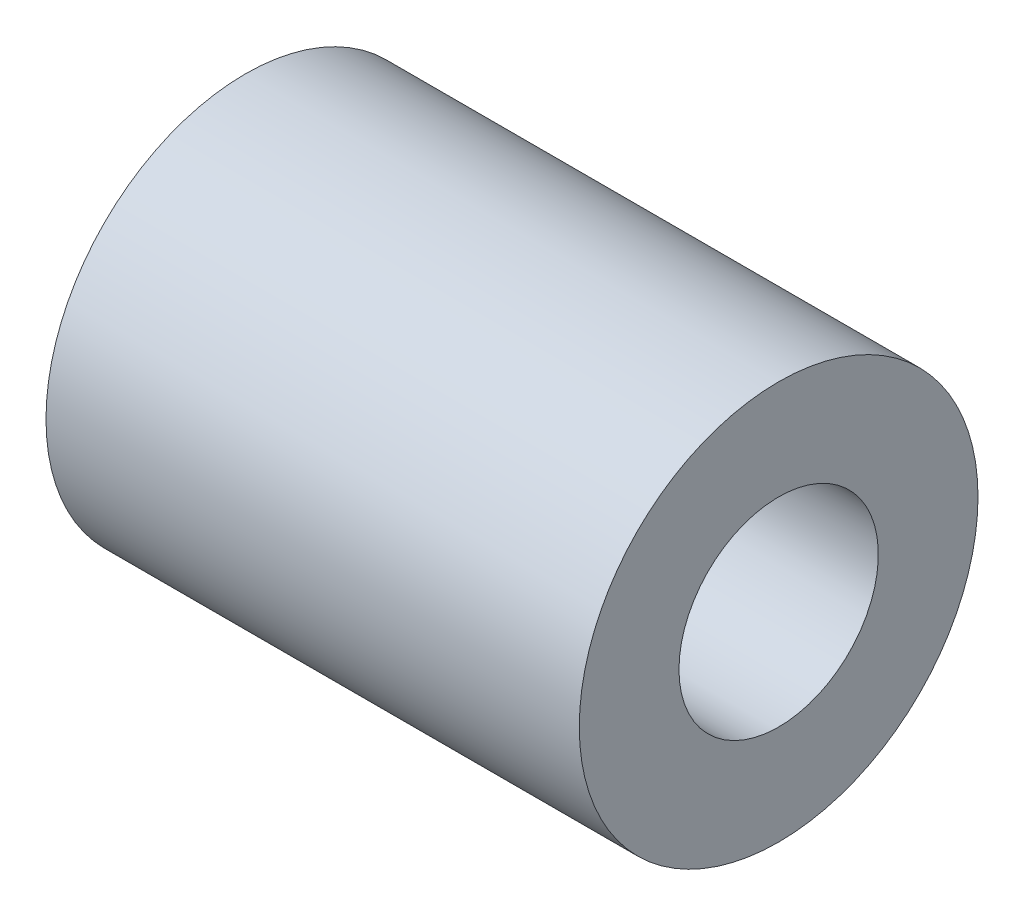
ISO-10303-21;
HEADER;
FILE_DESCRIPTION(('STEP AP214'),'2;1');
FILE_NAME('part.step','',(''),(''),'','','');
FILE_SCHEMA(('AUTOMOTIVE_DESIGN { 1 0 10303 214 1 1 1 1 }'));
ENDSEC;
DATA;
#1=APPLICATION_CONTEXT('core data for automotive mechanical design processes');
#2=APPLICATION_PROTOCOL_DEFINITION('international standard','automotive_design',2000,#1);
#3=PRODUCT_CONTEXT('',#1,'mechanical');
#4=PRODUCT('Part','Part','',(#3));
#5=PRODUCT_RELATED_PRODUCT_CATEGORY('part','',(#4));
#6=PRODUCT_DEFINITION_FORMATION('','',#4);
#7=PRODUCT_DEFINITION_CONTEXT('part definition',#1,'design');
#8=PRODUCT_DEFINITION('design','',#6,#7);
#9=PRODUCT_DEFINITION_SHAPE('','',#8);
#10=(LENGTH_UNIT() NAMED_UNIT(*) SI_UNIT(.MILLI.,.METRE.));
#11=(NAMED_UNIT(*) PLANE_ANGLE_UNIT() SI_UNIT($,.RADIAN.));
#12=(NAMED_UNIT(*) SI_UNIT($,.STERADIAN.) SOLID_ANGLE_UNIT());
#13=UNCERTAINTY_MEASURE_WITH_UNIT(LENGTH_MEASURE(1.E-05),#10,'distance_accuracy_value','');
#14=(GEOMETRIC_REPRESENTATION_CONTEXT(3) GLOBAL_UNCERTAINTY_ASSIGNED_CONTEXT((#13)) GLOBAL_UNIT_ASSIGNED_CONTEXT((#10,
#11,#12)) REPRESENTATION_CONTEXT('',''));
#15=CARTESIAN_POINT('',(0.,0.,0.));
#16=DIRECTION('',(0.,0.,1.));
#17=DIRECTION('',(1.,0.,0.));
#18=AXIS2_PLACEMENT_3D('',#15,#16,#17);
#19=CARTESIAN_POINT('',(34.25,-55.,7.));
#20=DIRECTION('',(-1.,0.,0.));
#21=DIRECTION('',(0.,0.,1.));
#22=AXIS2_PLACEMENT_3D('',#19,#20,#21);
#23=CYLINDRICAL_SURFACE('',#22,2.);
#24=CARTESIAN_POINT('',(44.95,-55.,7.));
#25=DIRECTION('',(-1.,0.,0.));
#26=DIRECTION('',(0.,0.,1.));
#27=AXIS2_PLACEMENT_3D('',#24,#25,#26);
#28=CIRCLE('',#27,2.);
#29=CARTESIAN_POINT('',(44.95,-55.,9.));
#30=VERTEX_POINT('',#29);
#31=EDGE_CURVE('E26',#30,#30,#28,.T.);
#32=ORIENTED_EDGE('',*,*,#31,.F.);
#33=EDGE_LOOP('',(#32));
#34=FACE_BOUND('',#33,.T.);
#35=CARTESIAN_POINT('',(34.25,-55.,7.));
#36=DIRECTION('',(-1.,0.,0.));
#37=DIRECTION('',(0.,0.,1.));
#38=AXIS2_PLACEMENT_3D('',#35,#36,#37);
#39=CIRCLE('',#38,2.);
#40=CARTESIAN_POINT('',(34.25,-55.,9.));
#41=VERTEX_POINT('',#40);
#42=EDGE_CURVE('E17',#41,#41,#39,.T.);
#43=ORIENTED_EDGE('',*,*,#42,.T.);
#44=EDGE_LOOP('',(#43));
#45=FACE_BOUND('',#44,.T.);
#46=ADVANCED_FACE('F14',(#34,#45),#23,.F.);
#47=CARTESIAN_POINT('',(34.25,-55.,7.));
#48=DIRECTION('',(1.,0.,0.));
#49=DIRECTION('',(0.,0.,-1.));
#50=AXIS2_PLACEMENT_3D('',#47,#48,#49);
#51=PLANE('',#50);
#52=ORIENTED_EDGE('',*,*,#42,.F.);
#53=EDGE_LOOP('',(#52));
#54=FACE_BOUND('',#53,.T.);
#55=CARTESIAN_POINT('',(34.25,-55.,7.));
#56=DIRECTION('',(-1.,0.,0.));
#57=DIRECTION('',(0.,0.,1.));
#58=AXIS2_PLACEMENT_3D('',#55,#56,#57);
#59=CIRCLE('',#58,4.);
#60=CARTESIAN_POINT('',(34.25,-55.,11.));
#61=VERTEX_POINT('',#60);
#62=EDGE_CURVE('E21',#61,#61,#59,.F.);
#63=ORIENTED_EDGE('',*,*,#62,.F.);
#64=EDGE_LOOP('',(#63));
#65=FACE_BOUND('',#64,.T.);
#66=ADVANCED_FACE('F35',(#54,#65),#51,.F.);
#67=CARTESIAN_POINT('',(44.95,-55.,7.));
#68=DIRECTION('',(1.,0.,0.));
#69=DIRECTION('',(0.,0.,-1.));
#70=AXIS2_PLACEMENT_3D('',#67,#68,#69);
#71=PLANE('',#70);
#72=ORIENTED_EDGE('',*,*,#31,.T.);
#73=EDGE_LOOP('',(#72));
#74=FACE_BOUND('',#73,.T.);
#75=CARTESIAN_POINT('',(44.95,-55.,7.));
#76=DIRECTION('',(-1.,0.,0.));
#77=DIRECTION('',(0.,0.,1.));
#78=AXIS2_PLACEMENT_3D('',#75,#76,#77);
#79=CIRCLE('',#78,4.);
#80=CARTESIAN_POINT('',(44.95,-55.,11.));
#81=VERTEX_POINT('',#80);
#82=EDGE_CURVE('E9',#81,#81,#79,.T.);
#83=ORIENTED_EDGE('',*,*,#82,.F.);
#84=EDGE_LOOP('',(#83));
#85=FACE_BOUND('',#84,.T.);
#86=ADVANCED_FACE('F38',(#74,#85),#71,.T.);
#87=CARTESIAN_POINT('',(34.25,-55.,7.));
#88=DIRECTION('',(-1.,0.,0.));
#89=DIRECTION('',(0.,0.,1.));
#90=AXIS2_PLACEMENT_3D('',#87,#88,#89);
#91=CYLINDRICAL_SURFACE('',#90,4.);
#92=ORIENTED_EDGE('',*,*,#82,.T.);
#93=EDGE_LOOP('',(#92));
#94=FACE_BOUND('',#93,.T.);
#95=ORIENTED_EDGE('',*,*,#62,.T.);
#96=EDGE_LOOP('',(#95));
#97=FACE_BOUND('',#96,.T.);
#98=ADVANCED_FACE('F41',(#94,#97),#91,.T.);
#99=CLOSED_SHELL('',(#46,#66,#86,#98));
#100=MANIFOLD_SOLID_BREP('B1',#99);
#101=ADVANCED_BREP_SHAPE_REPRESENTATION('',(#18,#100),#14);
#102=SHAPE_DEFINITION_REPRESENTATION(#9,#101);
ENDSEC;
END-ISO-10303-21;
